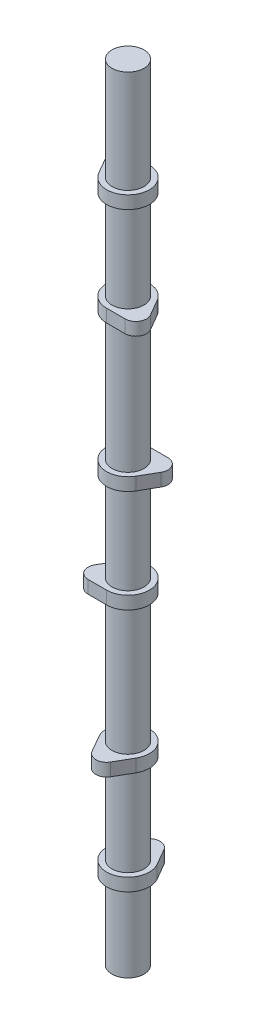
ISO-10303-21;
HEADER;
FILE_DESCRIPTION(('STEP AP214'),'2;1');
FILE_NAME('part.step','',(''),(''),'','','');
FILE_SCHEMA(('AUTOMOTIVE_DESIGN { 1 0 10303 214 1 1 1 1 }'));
ENDSEC;
DATA;
#1=APPLICATION_CONTEXT('core data for automotive mechanical design processes');
#2=APPLICATION_PROTOCOL_DEFINITION('international standard','automotive_design',2000,#1);
#3=PRODUCT_CONTEXT('',#1,'mechanical');
#4=PRODUCT('Part','Part','',(#3));
#5=PRODUCT_RELATED_PRODUCT_CATEGORY('part','',(#4));
#6=PRODUCT_DEFINITION_FORMATION('','',#4);
#7=PRODUCT_DEFINITION_CONTEXT('part definition',#1,'design');
#8=PRODUCT_DEFINITION('design','',#6,#7);
#9=PRODUCT_DEFINITION_SHAPE('','',#8);
#10=(LENGTH_UNIT() NAMED_UNIT(*) SI_UNIT(.MILLI.,.METRE.));
#11=(NAMED_UNIT(*) PLANE_ANGLE_UNIT() SI_UNIT($,.RADIAN.));
#12=(NAMED_UNIT(*) SI_UNIT($,.STERADIAN.) SOLID_ANGLE_UNIT());
#13=UNCERTAINTY_MEASURE_WITH_UNIT(LENGTH_MEASURE(1.E-05),#10,'distance_accuracy_value','');
#14=(GEOMETRIC_REPRESENTATION_CONTEXT(3) GLOBAL_UNCERTAINTY_ASSIGNED_CONTEXT((#13)) GLOBAL_UNIT_ASSIGNED_CONTEXT((#10,
#11,#12)) REPRESENTATION_CONTEXT('',''));
#15=CARTESIAN_POINT('',(0.,0.,0.));
#16=DIRECTION('',(0.,0.,1.));
#17=DIRECTION('',(1.,0.,0.));
#18=AXIS2_PLACEMENT_3D('',#15,#16,#17);
#19=CARTESIAN_POINT('',(0.,419.56,0.));
#20=DIRECTION('',(0.,-1.,0.));
#21=DIRECTION('',(0.,0.,-1.));
#22=AXIS2_PLACEMENT_3D('',#19,#20,#21);
#23=CYLINDRICAL_SURFACE('',#22,9.5);
#24=CARTESIAN_POINT('',(0.,297.72,0.));
#25=DIRECTION('',(0.,1.,0.));
#26=DIRECTION('',(0.,0.,1.));
#27=AXIS2_PLACEMENT_3D('',#24,#25,#26);
#28=CIRCLE('',#27,9.5);
#29=CARTESIAN_POINT('',(0.,297.72,9.5));
#30=VERTEX_POINT('',#29);
#31=EDGE_CURVE('E268',#30,#30,#28,.T.);
#32=ORIENTED_EDGE('',*,*,#31,.T.);
#33=EDGE_LOOP('',(#32));
#34=FACE_BOUND('',#33,.T.);
#35=CARTESIAN_POINT('',(0.,351.06,0.));
#36=DIRECTION('',(0.,1.,0.));
#37=DIRECTION('',(0.,0.,1.));
#38=AXIS2_PLACEMENT_3D('',#35,#36,#37);
#39=CIRCLE('',#38,9.5);
#40=CARTESIAN_POINT('',(0.,351.06,9.5));
#41=VERTEX_POINT('',#40);
#42=EDGE_CURVE('E11',#41,#41,#39,.T.);
#43=ORIENTED_EDGE('',*,*,#42,.F.);
#44=EDGE_LOOP('',(#43));
#45=FACE_BOUND('',#44,.T.);
#46=ADVANCED_FACE('F34',(#34,#45),#23,.T.);
#47=CARTESIAN_POINT('',(0.,213.63,0.));
#48=DIRECTION('',(0.,1.,0.));
#49=DIRECTION('',(0.,0.,1.));
#50=AXIS2_PLACEMENT_3D('',#47,#48,#49);
#51=CIRCLE('',#50,9.5);
#52=CARTESIAN_POINT('',(0.,213.63,9.5));
#53=VERTEX_POINT('',#52);
#54=EDGE_CURVE('E299',#53,#53,#51,.T.);
#55=ORIENTED_EDGE('',*,*,#54,.T.);
#56=EDGE_LOOP('',(#55));
#57=FACE_BOUND('',#56,.T.);
#58=CARTESIAN_POINT('',(0.,290.1,0.));
#59=DIRECTION('',(0.,1.,0.));
#60=DIRECTION('',(0.,0.,1.));
#61=AXIS2_PLACEMENT_3D('',#58,#59,#60);
#62=CIRCLE('',#61,9.5);
#63=CARTESIAN_POINT('',(0.,290.1,9.5));
#64=VERTEX_POINT('',#63);
#65=EDGE_CURVE('E44',#64,#64,#62,.T.);
#66=ORIENTED_EDGE('',*,*,#65,.F.);
#67=EDGE_LOOP('',(#66));
#68=FACE_BOUND('',#67,.T.);
#69=ADVANCED_FACE('F450',(#57,#68),#23,.T.);
#70=CARTESIAN_POINT('',(0.,152.67,0.));
#71=DIRECTION('',(0.,1.,0.));
#72=DIRECTION('',(0.,0.,1.));
#73=AXIS2_PLACEMENT_3D('',#70,#71,#72);
#74=CIRCLE('',#73,9.5);
#75=CARTESIAN_POINT('',(0.,152.67,9.5));
#76=VERTEX_POINT('',#75);
#77=EDGE_CURVE('E330',#76,#76,#74,.T.);
#78=ORIENTED_EDGE('',*,*,#77,.T.);
#79=EDGE_LOOP('',(#78));
#80=FACE_BOUND('',#79,.T.);
#81=CARTESIAN_POINT('',(0.,206.01,0.));
#82=DIRECTION('',(0.,1.,0.));
#83=DIRECTION('',(0.,0.,1.));
#84=AXIS2_PLACEMENT_3D('',#81,#82,#83);
#85=CIRCLE('',#84,9.5);
#86=CARTESIAN_POINT('',(0.,206.01,9.5));
#87=VERTEX_POINT('',#86);
#88=EDGE_CURVE('E403',#87,#87,#85,.T.);
#89=ORIENTED_EDGE('',*,*,#88,.F.);
#90=EDGE_LOOP('',(#89));
#91=FACE_BOUND('',#90,.T.);
#92=ADVANCED_FACE('F456',(#80,#91),#23,.T.);
#93=CARTESIAN_POINT('',(0.,68.58,0.));
#94=DIRECTION('',(0.,1.,0.));
#95=DIRECTION('',(0.,0.,1.));
#96=AXIS2_PLACEMENT_3D('',#93,#94,#95);
#97=CIRCLE('',#96,9.5);
#98=CARTESIAN_POINT('',(0.,68.58,9.5));
#99=VERTEX_POINT('',#98);
#100=EDGE_CURVE('E361',#99,#99,#97,.T.);
#101=ORIENTED_EDGE('',*,*,#100,.T.);
#102=EDGE_LOOP('',(#101));
#103=FACE_BOUND('',#102,.T.);
#104=CARTESIAN_POINT('',(0.,145.05,0.));
#105=DIRECTION('',(0.,1.,0.));
#106=DIRECTION('',(0.,0.,1.));
#107=AXIS2_PLACEMENT_3D('',#104,#105,#106);
#108=CIRCLE('',#107,9.5);
#109=CARTESIAN_POINT('',(0.,145.05,9.5));
#110=VERTEX_POINT('',#109);
#111=EDGE_CURVE('E398',#110,#110,#108,.T.);
#112=ORIENTED_EDGE('',*,*,#111,.F.);
#113=EDGE_LOOP('',(#112));
#114=FACE_BOUND('',#113,.T.);
#115=ADVANCED_FACE('F487',(#103,#114),#23,.T.);
#116=CARTESIAN_POINT('',(0.,7.62000000000002,0.));
#117=DIRECTION('',(0.,1.,0.));
#118=DIRECTION('',(0.,0.,1.));
#119=AXIS2_PLACEMENT_3D('',#116,#117,#118);
#120=CIRCLE('',#119,9.5);
#121=CARTESIAN_POINT('',(0.,7.62000000000002,9.5));
#122=VERTEX_POINT('',#121);
#123=EDGE_CURVE('E365',#122,#122,#120,.F.);
#124=ORIENTED_EDGE('',*,*,#123,.F.);
#125=EDGE_LOOP('',(#124));
#126=FACE_BOUND('',#125,.T.);
#127=CARTESIAN_POINT('',(0.,60.96,0.));
#128=DIRECTION('',(0.,1.,0.));
#129=DIRECTION('',(0.,0.,1.));
#130=AXIS2_PLACEMENT_3D('',#127,#128,#129);
#131=CIRCLE('',#130,9.5);
#132=CARTESIAN_POINT('',(0.,60.96,9.5));
#133=VERTEX_POINT('',#132);
#134=EDGE_CURVE('E395',#133,#133,#131,.T.);
#135=ORIENTED_EDGE('',*,*,#134,.F.);
#136=EDGE_LOOP('',(#135));
#137=FACE_BOUND('',#136,.T.);
#138=ADVANCED_FACE('F475',(#126,#137),#23,.T.);
#139=CARTESIAN_POINT('',(0.,7.62,-12.7));
#140=DIRECTION('',(0.,-1.,0.));
#141=DIRECTION('',(0.,0.,-1.));
#142=AXIS2_PLACEMENT_3D('',#139,#140,#141);
#143=CYLINDRICAL_SURFACE('',#142,6.35);
#144=CARTESIAN_POINT('',(0.,0.,-12.7));
#145=DIRECTION('',(0.,1.,0.));
#146=DIRECTION('',(0.,0.,1.));
#147=AXIS2_PLACEMENT_3D('',#144,#145,#146);
#148=CIRCLE('',#147,6.35);
#149=CARTESIAN_POINT('',(5.49926131403118,0.,-15.875));
#150=VERTEX_POINT('',#149);
#151=CARTESIAN_POINT('',(-5.49926131403118,0.,-15.875));
#152=VERTEX_POINT('',#151);
#153=EDGE_CURVE('E371',#150,#152,#148,.T.);
#154=ORIENTED_EDGE('',*,*,#153,.T.);
#155=DIRECTION('',(0.,-1.,0.));
#156=VECTOR('',#155,1.);
#157=CARTESIAN_POINT('',(-5.49926131403118,7.62,-15.875));
#158=LINE('',#157,#156);
#159=CARTESIAN_POINT('',(-5.49926131403118,7.62,-15.875));
#160=VERTEX_POINT('',#159);
#161=EDGE_CURVE('E390',#160,#152,#158,.T.);
#162=ORIENTED_EDGE('',*,*,#161,.F.);
#163=CARTESIAN_POINT('',(0.,7.62,-12.7));
#164=DIRECTION('',(0.,1.,0.));
#165=DIRECTION('',(0.,0.,1.));
#166=AXIS2_PLACEMENT_3D('',#163,#164,#165);
#167=CIRCLE('',#166,6.35);
#168=CARTESIAN_POINT('',(5.49926131403118,7.62,-15.875));
#169=VERTEX_POINT('',#168);
#170=EDGE_CURVE('E372',#169,#160,#167,.T.);
#171=ORIENTED_EDGE('',*,*,#170,.F.);
#172=DIRECTION('',(0.,-1.,0.));
#173=VECTOR('',#172,1.);
#174=CARTESIAN_POINT('',(5.49926131403118,7.62,-15.875));
#175=LINE('',#174,#173);
#176=EDGE_CURVE('E378',#169,#150,#175,.T.);
#177=ORIENTED_EDGE('',*,*,#176,.T.);
#178=EDGE_LOOP('',(#154,#162,#171,#177));
#179=FACE_BOUND('',#178,.T.);
#180=ADVANCED_FACE('F36',(#179),#143,.T.);
#181=CARTESIAN_POINT('',(-5.49926131403118,7.62,-15.875));
#182=DIRECTION('',(0.866025403784438,0.,0.5));
#183=DIRECTION('',(0.5,0.,-0.866025403784439));
#184=AXIS2_PLACEMENT_3D('',#181,#182,#183);
#185=PLANE('',#184);
#186=DIRECTION('',(-0.5,0.,0.866025403784439));
#187=VECTOR('',#186,1.);
#188=CARTESIAN_POINT('',(-5.49926131403118,0.,-15.875));
#189=LINE('',#188,#187);
#190=CARTESIAN_POINT('',(-10.9985226280624,0.,-6.34999999999999));
#191=VERTEX_POINT('',#190);
#192=EDGE_CURVE('E381',#152,#191,#189,.T.);
#193=ORIENTED_EDGE('',*,*,#192,.T.);
#194=DIRECTION('',(0.,-1.,0.));
#195=VECTOR('',#194,1.);
#196=CARTESIAN_POINT('',(-10.9985226280624,7.62,-6.34999999999999));
#197=LINE('',#196,#195);
#198=CARTESIAN_POINT('',(-10.9985226280624,7.62,-6.34999999999999));
#199=VERTEX_POINT('',#198);
#200=EDGE_CURVE('E388',#199,#191,#197,.T.);
#201=ORIENTED_EDGE('',*,*,#200,.F.);
#202=DIRECTION('',(-0.5,0.,0.866025403784439));
#203=VECTOR('',#202,1.);
#204=CARTESIAN_POINT('',(-5.49926131403118,7.62,-15.875));
#205=LINE('',#204,#203);
#206=EDGE_CURVE('E84',#160,#199,#205,.T.);
#207=ORIENTED_EDGE('',*,*,#206,.F.);
#208=ORIENTED_EDGE('',*,*,#161,.T.);
#209=EDGE_LOOP('',(#193,#201,#207,#208));
#210=FACE_BOUND('',#209,.T.);
#211=ADVANCED_FACE('F493',(#210),#185,.F.);
#212=CARTESIAN_POINT('',(0.,7.62,0.));
#213=DIRECTION('',(0.,-1.,0.));
#214=DIRECTION('',(0.,0.,-1.));
#215=AXIS2_PLACEMENT_3D('',#212,#213,#214);
#216=CYLINDRICAL_SURFACE('',#215,12.7);
#217=CARTESIAN_POINT('',(0.,0.,0.));
#218=DIRECTION('',(0.,1.,0.));
#219=DIRECTION('',(0.,0.,1.));
#220=AXIS2_PLACEMENT_3D('',#217,#218,#219);
#221=CIRCLE('',#220,12.7);
#222=CARTESIAN_POINT('',(10.9985226280624,0.,-6.35));
#223=VERTEX_POINT('',#222);
#224=EDGE_CURVE('E70',#191,#223,#221,.T.);
#225=ORIENTED_EDGE('',*,*,#224,.T.);
#226=DIRECTION('',(0.,-1.,0.));
#227=VECTOR('',#226,1.);
#228=CARTESIAN_POINT('',(10.9985226280624,7.62,-6.35));
#229=LINE('',#228,#227);
#230=CARTESIAN_POINT('',(10.9985226280624,7.62,-6.35));
#231=VERTEX_POINT('',#230);
#232=EDGE_CURVE('E386',#231,#223,#229,.T.);
#233=ORIENTED_EDGE('',*,*,#232,.F.);
#234=CARTESIAN_POINT('',(0.,7.62,0.));
#235=DIRECTION('',(0.,1.,0.));
#236=DIRECTION('',(0.,0.,1.));
#237=AXIS2_PLACEMENT_3D('',#234,#235,#236);
#238=CIRCLE('',#237,12.7);
#239=EDGE_CURVE('E375',#199,#231,#238,.T.);
#240=ORIENTED_EDGE('',*,*,#239,.F.);
#241=ORIENTED_EDGE('',*,*,#200,.T.);
#242=EDGE_LOOP('',(#225,#233,#240,#241));
#243=FACE_BOUND('',#242,.T.);
#244=ADVANCED_FACE('F825',(#243),#216,.T.);
#245=CARTESIAN_POINT('',(5.49926131403118,7.62,-15.875));
#246=DIRECTION('',(-0.866025403784439,0.,0.5));
#247=DIRECTION('',(0.5,0.,0.866025403784439));
#248=AXIS2_PLACEMENT_3D('',#245,#246,#247);
#249=PLANE('',#248);
#250=DIRECTION('',(-0.5,0.,-0.866025403784439));
#251=VECTOR('',#250,1.);
#252=CARTESIAN_POINT('',(5.49926131403118,0.,-15.875));
#253=LINE('',#252,#251);
#254=EDGE_CURVE('E76',#223,#150,#253,.T.);
#255=ORIENTED_EDGE('',*,*,#254,.T.);
#256=ORIENTED_EDGE('',*,*,#176,.F.);
#257=DIRECTION('',(-0.5,0.,-0.866025403784439));
#258=VECTOR('',#257,1.);
#259=CARTESIAN_POINT('',(5.49926131403118,7.62,-15.875));
#260=LINE('',#259,#258);
#261=EDGE_CURVE('E52',#231,#169,#260,.T.);
#262=ORIENTED_EDGE('',*,*,#261,.F.);
#263=ORIENTED_EDGE('',*,*,#232,.T.);
#264=EDGE_LOOP('',(#255,#256,#262,#263));
#265=FACE_BOUND('',#264,.T.);
#266=ADVANCED_FACE('F819',(#265),#249,.F.);
#267=CARTESIAN_POINT('',(0.,7.62,-12.7));
#268=DIRECTION('',(0.,1.,0.));
#269=DIRECTION('',(0.,0.,1.));
#270=AXIS2_PLACEMENT_3D('',#267,#268,#269);
#271=PLANE('',#270);
#272=ORIENTED_EDGE('',*,*,#123,.T.);
#273=EDGE_LOOP('',(#272));
#274=FACE_BOUND('',#273,.T.);
#275=ORIENTED_EDGE('',*,*,#170,.T.);
#276=ORIENTED_EDGE('',*,*,#206,.T.);
#277=ORIENTED_EDGE('',*,*,#239,.T.);
#278=ORIENTED_EDGE('',*,*,#261,.T.);
#279=EDGE_LOOP('',(#275,#276,#277,#278));
#280=FACE_BOUND('',#279,.T.);
#281=ADVANCED_FACE('F824',(#274,#280),#271,.T.);
#282=CARTESIAN_POINT('',(0.,0.,-12.7));
#283=DIRECTION('',(0.,1.,0.));
#284=DIRECTION('',(0.,0.,1.));
#285=AXIS2_PLACEMENT_3D('',#282,#283,#284);
#286=PLANE('',#285);
#287=CARTESIAN_POINT('',(0.,0.,0.));
#288=DIRECTION('',(0.,1.,0.));
#289=DIRECTION('',(0.,0.,1.));
#290=AXIS2_PLACEMENT_3D('',#287,#288,#289);
#291=CIRCLE('',#290,9.5);
#292=CARTESIAN_POINT('',(0.,0.,9.5));
#293=VERTEX_POINT('',#292);
#294=EDGE_CURVE('E392',#293,#293,#291,.F.);
#295=ORIENTED_EDGE('',*,*,#294,.F.);
#296=EDGE_LOOP('',(#295));
#297=FACE_BOUND('',#296,.T.);
#298=ORIENTED_EDGE('',*,*,#153,.F.);
#299=ORIENTED_EDGE('',*,*,#254,.F.);
#300=ORIENTED_EDGE('',*,*,#224,.F.);
#301=ORIENTED_EDGE('',*,*,#192,.F.);
#302=EDGE_LOOP('',(#298,#299,#300,#301));
#303=FACE_BOUND('',#302,.T.);
#304=ADVANCED_FACE('F483',(#297,#303),#286,.F.);
#305=CARTESIAN_POINT('',(0.,-46.53,0.));
#306=DIRECTION('',(0.,1.,0.));
#307=DIRECTION('',(0.,0.,1.));
#308=AXIS2_PLACEMENT_3D('',#305,#306,#307);
#309=PLANE('',#308);
#310=CARTESIAN_POINT('',(0.,-46.53,0.));
#311=DIRECTION('',(0.,1.,0.));
#312=DIRECTION('',(0.,0.,1.));
#313=AXIS2_PLACEMENT_3D('',#310,#311,#312);
#314=CIRCLE('',#313,9.5);
#315=CARTESIAN_POINT('',(0.,-46.53,9.5));
#316=VERTEX_POINT('',#315);
#317=EDGE_CURVE('E366',#316,#316,#314,.T.);
#318=ORIENTED_EDGE('',*,*,#317,.F.);
#319=EDGE_LOOP('',(#318));
#320=FACE_BOUND('',#319,.T.);
#321=ADVANCED_FACE('F473',(#320),#309,.F.);
#322=ORIENTED_EDGE('',*,*,#317,.T.);
#323=EDGE_LOOP('',(#322));
#324=FACE_BOUND('',#323,.T.);
#325=ORIENTED_EDGE('',*,*,#294,.T.);
#326=EDGE_LOOP('',(#325));
#327=FACE_BOUND('',#326,.T.);
#328=ADVANCED_FACE('F463',(#324,#327),#23,.T.);
#329=CARTESIAN_POINT('',(0.,68.58,12.7));
#330=DIRECTION('',(0.,-1.,0.));
#331=DIRECTION('',(0.,0.,1.));
#332=AXIS2_PLACEMENT_3D('',#329,#330,#331);
#333=CYLINDRICAL_SURFACE('',#332,6.35);
#334=CARTESIAN_POINT('',(0.,60.96,12.7));
#335=DIRECTION('',(0.,1.,0.));
#336=DIRECTION('',(0.,0.,-1.));
#337=AXIS2_PLACEMENT_3D('',#334,#335,#336);
#338=CIRCLE('',#337,6.35);
#339=CARTESIAN_POINT('',(-5.4992613140313,60.96,15.875));
#340=VERTEX_POINT('',#339);
#341=CARTESIAN_POINT('',(5.49926131403107,60.96,15.875));
#342=VERTEX_POINT('',#341);
#343=EDGE_CURVE('E342',#340,#342,#338,.T.);
#344=ORIENTED_EDGE('',*,*,#343,.T.);
#345=DIRECTION('',(0.,-1.,0.));
#346=VECTOR('',#345,1.);
#347=CARTESIAN_POINT('',(5.49926131403107,68.58,15.875));
#348=LINE('',#347,#346);
#349=CARTESIAN_POINT('',(5.49926131403107,68.58,15.875));
#350=VERTEX_POINT('',#349);
#351=EDGE_CURVE('E358',#350,#342,#348,.T.);
#352=ORIENTED_EDGE('',*,*,#351,.F.);
#353=CARTESIAN_POINT('',(0.,68.58,12.7));
#354=DIRECTION('',(0.,1.,0.));
#355=DIRECTION('',(0.,0.,-1.));
#356=AXIS2_PLACEMENT_3D('',#353,#354,#355);
#357=CIRCLE('',#356,6.35);
#358=CARTESIAN_POINT('',(-5.4992613140313,68.58,15.875));
#359=VERTEX_POINT('',#358);
#360=EDGE_CURVE('E331',#359,#350,#357,.T.);
#361=ORIENTED_EDGE('',*,*,#360,.F.);
#362=DIRECTION('',(0.,-1.,0.));
#363=VECTOR('',#362,1.);
#364=CARTESIAN_POINT('',(-5.4992613140313,68.58,15.875));
#365=LINE('',#364,#363);
#366=EDGE_CURVE('E341',#359,#340,#365,.T.);
#367=ORIENTED_EDGE('',*,*,#366,.T.);
#368=EDGE_LOOP('',(#344,#352,#361,#367));
#369=FACE_BOUND('',#368,.T.);
#370=ADVANCED_FACE('F472',(#369),#333,.T.);
#371=CARTESIAN_POINT('',(5.49926131403107,68.58,15.875));
#372=DIRECTION('',(-0.866025403784435,0.,-0.500000000000006));
#373=DIRECTION('',(-0.500000000000006,0.,0.866025403784435));
#374=AXIS2_PLACEMENT_3D('',#371,#372,#373);
#375=PLANE('',#374);
#376=DIRECTION('',(0.500000000000006,0.,-0.866025403784435));
#377=VECTOR('',#376,1.);
#378=CARTESIAN_POINT('',(5.49926131403107,60.96,15.875));
#379=LINE('',#378,#377);
#380=CARTESIAN_POINT('',(10.9985226280623,60.96,6.35000000000007));
#381=VERTEX_POINT('',#380);
#382=EDGE_CURVE('E345',#342,#381,#379,.T.);
#383=ORIENTED_EDGE('',*,*,#382,.T.);
#384=DIRECTION('',(0.,-1.,0.));
#385=VECTOR('',#384,1.);
#386=CARTESIAN_POINT('',(10.9985226280623,68.58,6.35000000000007));
#387=LINE('',#386,#385);
#388=CARTESIAN_POINT('',(10.9985226280623,68.58,6.35000000000007));
#389=VERTEX_POINT('',#388);
#390=EDGE_CURVE('E355',#389,#381,#387,.T.);
#391=ORIENTED_EDGE('',*,*,#390,.F.);
#392=DIRECTION('',(0.500000000000006,0.,-0.866025403784435));
#393=VECTOR('',#392,1.);
#394=CARTESIAN_POINT('',(5.49926131403107,68.58,15.875));
#395=LINE('',#394,#393);
#396=EDGE_CURVE('E334',#350,#389,#395,.T.);
#397=ORIENTED_EDGE('',*,*,#396,.F.);
#398=ORIENTED_EDGE('',*,*,#351,.T.);
#399=EDGE_LOOP('',(#383,#391,#397,#398));
#400=FACE_BOUND('',#399,.T.);
#401=ADVANCED_FACE('F480',(#400),#375,.F.);
#402=CARTESIAN_POINT('',(0.,68.58,0.));
#403=DIRECTION('',(0.,-1.,0.));
#404=DIRECTION('',(0.,0.,1.));
#405=AXIS2_PLACEMENT_3D('',#402,#403,#404);
#406=CYLINDRICAL_SURFACE('',#405,12.7);
#407=CARTESIAN_POINT('',(0.,60.96,0.));
#408=DIRECTION('',(0.,1.,0.));
#409=DIRECTION('',(0.,0.,-1.));
#410=AXIS2_PLACEMENT_3D('',#407,#408,#409);
#411=CIRCLE('',#410,12.7);
#412=CARTESIAN_POINT('',(-10.9985226280624,60.96,6.34999999999992));
#413=VERTEX_POINT('',#412);
#414=EDGE_CURVE('E347',#381,#413,#411,.T.);
#415=ORIENTED_EDGE('',*,*,#414,.T.);
#416=DIRECTION('',(0.,-1.,0.));
#417=VECTOR('',#416,1.);
#418=CARTESIAN_POINT('',(-10.9985226280624,68.58,6.34999999999992));
#419=LINE('',#418,#417);
#420=CARTESIAN_POINT('',(-10.9985226280624,68.58,6.34999999999992));
#421=VERTEX_POINT('',#420);
#422=EDGE_CURVE('E352',#421,#413,#419,.T.);
#423=ORIENTED_EDGE('',*,*,#422,.F.);
#424=CARTESIAN_POINT('',(0.,68.58,0.));
#425=DIRECTION('',(0.,1.,0.));
#426=DIRECTION('',(0.,0.,-1.));
#427=AXIS2_PLACEMENT_3D('',#424,#425,#426);
#428=CIRCLE('',#427,12.7);
#429=EDGE_CURVE('E337',#389,#421,#428,.T.);
#430=ORIENTED_EDGE('',*,*,#429,.F.);
#431=ORIENTED_EDGE('',*,*,#390,.T.);
#432=EDGE_LOOP('',(#415,#423,#430,#431));
#433=FACE_BOUND('',#432,.T.);
#434=ADVANCED_FACE('F518',(#433),#406,.T.);
#435=CARTESIAN_POINT('',(-5.4992613140313,68.58,15.875));
#436=DIRECTION('',(0.866025403784442,0.,-0.499999999999994));
#437=DIRECTION('',(-0.499999999999994,0.,-0.866025403784442));
#438=AXIS2_PLACEMENT_3D('',#435,#436,#437);
#439=PLANE('',#438);
#440=DIRECTION('',(0.499999999999994,0.,0.866025403784442));
#441=VECTOR('',#440,1.);
#442=CARTESIAN_POINT('',(-5.4992613140313,60.96,15.875));
#443=LINE('',#442,#441);
#444=EDGE_CURVE('E335',#413,#340,#443,.T.);
#445=ORIENTED_EDGE('',*,*,#444,.T.);
#446=ORIENTED_EDGE('',*,*,#366,.F.);
#447=DIRECTION('',(0.499999999999994,0.,0.866025403784442));
#448=VECTOR('',#447,1.);
#449=CARTESIAN_POINT('',(-5.4992613140313,68.58,15.875));
#450=LINE('',#449,#448);
#451=EDGE_CURVE('E339',#421,#359,#450,.T.);
#452=ORIENTED_EDGE('',*,*,#451,.F.);
#453=ORIENTED_EDGE('',*,*,#422,.T.);
#454=EDGE_LOOP('',(#445,#446,#452,#453));
#455=FACE_BOUND('',#454,.T.);
#456=ADVANCED_FACE('F514',(#455),#439,.F.);
#457=CARTESIAN_POINT('',(0.,68.58,12.7));
#458=DIRECTION('',(0.,1.,0.));
#459=DIRECTION('',(0.,0.,-1.));
#460=AXIS2_PLACEMENT_3D('',#457,#458,#459);
#461=PLANE('',#460);
#462=ORIENTED_EDGE('',*,*,#100,.F.);
#463=EDGE_LOOP('',(#462));
#464=FACE_BOUND('',#463,.T.);
#465=ORIENTED_EDGE('',*,*,#360,.T.);
#466=ORIENTED_EDGE('',*,*,#396,.T.);
#467=ORIENTED_EDGE('',*,*,#429,.T.);
#468=ORIENTED_EDGE('',*,*,#451,.T.);
#469=EDGE_LOOP('',(#465,#466,#467,#468));
#470=FACE_BOUND('',#469,.T.);
#471=ADVANCED_FACE('F504',(#464,#470),#461,.T.);
#472=CARTESIAN_POINT('',(0.,60.96,12.7));
#473=DIRECTION('',(0.,1.,0.));
#474=DIRECTION('',(0.,0.,-1.));
#475=AXIS2_PLACEMENT_3D('',#472,#473,#474);
#476=PLANE('',#475);
#477=ORIENTED_EDGE('',*,*,#134,.T.);
#478=EDGE_LOOP('',(#477));
#479=FACE_BOUND('',#478,.T.);
#480=ORIENTED_EDGE('',*,*,#343,.F.);
#481=ORIENTED_EDGE('',*,*,#444,.F.);
#482=ORIENTED_EDGE('',*,*,#414,.F.);
#483=ORIENTED_EDGE('',*,*,#382,.F.);
#484=EDGE_LOOP('',(#480,#481,#482,#483));
#485=FACE_BOUND('',#484,.T.);
#486=ADVANCED_FACE('F500',(#479,#485),#476,.F.);
#487=CARTESIAN_POINT('',(-10.9985226280623,152.67,6.35000000000005));
#488=DIRECTION('',(0.,-1.,0.));
#489=DIRECTION('',(-0.866025403784436,0.,0.500000000000004));
#490=AXIS2_PLACEMENT_3D('',#487,#488,#489);
#491=CYLINDRICAL_SURFACE('',#490,6.35);
#492=CARTESIAN_POINT('',(-10.9985226280623,145.05,6.35000000000005));
#493=DIRECTION('',(0.,1.,0.));
#494=DIRECTION('',(0.866025403784436,0.,-0.500000000000004));
#495=AXIS2_PLACEMENT_3D('',#492,#493,#494);
#496=CIRCLE('',#495,6.35);
#497=CARTESIAN_POINT('',(-16.4977839420935,145.05,3.17500000000008));
#498=VERTEX_POINT('',#497);
#499=CARTESIAN_POINT('',(-10.9985226280623,145.05,12.7000000000001));
#500=VERTEX_POINT('',#499);
#501=EDGE_CURVE('E311',#498,#500,#496,.T.);
#502=ORIENTED_EDGE('',*,*,#501,.T.);
#503=DIRECTION('',(0.,-1.,0.));
#504=VECTOR('',#503,1.);
#505=CARTESIAN_POINT('',(-10.9985226280623,152.67,12.7000000000001));
#506=LINE('',#505,#504);
#507=CARTESIAN_POINT('',(-10.9985226280623,152.67,12.7000000000001));
#508=VERTEX_POINT('',#507);
#509=EDGE_CURVE('E327',#508,#500,#506,.T.);
#510=ORIENTED_EDGE('',*,*,#509,.F.);
#511=CARTESIAN_POINT('',(-10.9985226280623,152.67,6.35000000000005));
#512=DIRECTION('',(0.,1.,0.));
#513=DIRECTION('',(0.866025403784436,0.,-0.500000000000004));
#514=AXIS2_PLACEMENT_3D('',#511,#512,#513);
#515=CIRCLE('',#514,6.35);
#516=CARTESIAN_POINT('',(-16.4977839420935,152.67,3.17500000000008));
#517=VERTEX_POINT('',#516);
#518=EDGE_CURVE('E300',#517,#508,#515,.T.);
#519=ORIENTED_EDGE('',*,*,#518,.F.);
#520=DIRECTION('',(0.,-1.,0.));
#521=VECTOR('',#520,1.);
#522=CARTESIAN_POINT('',(-16.4977839420935,152.67,3.17500000000008));
#523=LINE('',#522,#521);
#524=EDGE_CURVE('E310',#517,#498,#523,.T.);
#525=ORIENTED_EDGE('',*,*,#524,.T.);
#526=EDGE_LOOP('',(#502,#510,#519,#525));
#527=FACE_BOUND('',#526,.T.);
#528=ADVANCED_FACE('F503',(#527),#491,.T.);
#529=CARTESIAN_POINT('',(-10.9985226280623,152.67,12.7000000000001));
#530=DIRECTION('',(0.,0.,-1.));
#531=DIRECTION('',(-1.,0.,0.));
#532=AXIS2_PLACEMENT_3D('',#529,#530,#531);
#533=PLANE('',#532);
#534=DIRECTION('',(1.,0.,0.));
#535=VECTOR('',#534,1.);
#536=CARTESIAN_POINT('',(-10.9985226280623,145.05,12.7000000000001));
#537=LINE('',#536,#535);
#538=CARTESIAN_POINT('',(0.,145.05,12.7));
#539=VERTEX_POINT('',#538);
#540=EDGE_CURVE('E314',#500,#539,#537,.T.);
#541=ORIENTED_EDGE('',*,*,#540,.T.);
#542=DIRECTION('',(0.,-1.,0.));
#543=VECTOR('',#542,1.);
#544=CARTESIAN_POINT('',(0.,152.67,12.7));
#545=LINE('',#544,#543);
#546=CARTESIAN_POINT('',(0.,152.67,12.7));
#547=VERTEX_POINT('',#546);
#548=EDGE_CURVE('E324',#547,#539,#545,.T.);
#549=ORIENTED_EDGE('',*,*,#548,.F.);
#550=DIRECTION('',(1.,0.,0.));
#551=VECTOR('',#550,1.);
#552=CARTESIAN_POINT('',(-10.9985226280623,152.67,12.7000000000001));
#553=LINE('',#552,#551);
#554=EDGE_CURVE('E303',#508,#547,#553,.T.);
#555=ORIENTED_EDGE('',*,*,#554,.F.);
#556=ORIENTED_EDGE('',*,*,#509,.T.);
#557=EDGE_LOOP('',(#541,#549,#555,#556));
#558=FACE_BOUND('',#557,.T.);
#559=ADVANCED_FACE('F567',(#558),#533,.F.);
#560=CARTESIAN_POINT('',(0.,152.67,0.));
#561=DIRECTION('',(0.,-1.,0.));
#562=DIRECTION('',(-0.866025403784436,0.,0.500000000000004));
#563=AXIS2_PLACEMENT_3D('',#560,#561,#562);
#564=CYLINDRICAL_SURFACE('',#563,12.7);
#565=CARTESIAN_POINT('',(0.,145.05,0.));
#566=DIRECTION('',(0.,1.,0.));
#567=DIRECTION('',(0.866025403784436,0.,-0.500000000000004));
#568=AXIS2_PLACEMENT_3D('',#565,#566,#567);
#569=CIRCLE('',#568,12.7);
#570=CARTESIAN_POINT('',(-10.9985226280624,145.05,-6.34999999999995));
#571=VERTEX_POINT('',#570);
#572=EDGE_CURVE('E316',#539,#571,#569,.T.);
#573=ORIENTED_EDGE('',*,*,#572,.T.);
#574=DIRECTION('',(0.,-1.,0.));
#575=VECTOR('',#574,1.);
#576=CARTESIAN_POINT('',(-10.9985226280624,152.67,-6.34999999999995));
#577=LINE('',#576,#575);
#578=CARTESIAN_POINT('',(-10.9985226280624,152.67,-6.34999999999995));
#579=VERTEX_POINT('',#578);
#580=EDGE_CURVE('E321',#579,#571,#577,.T.);
#581=ORIENTED_EDGE('',*,*,#580,.F.);
#582=CARTESIAN_POINT('',(0.,152.67,0.));
#583=DIRECTION('',(0.,1.,0.));
#584=DIRECTION('',(0.866025403784436,0.,-0.500000000000004));
#585=AXIS2_PLACEMENT_3D('',#582,#583,#584);
#586=CIRCLE('',#585,12.7);
#587=EDGE_CURVE('E306',#547,#579,#586,.T.);
#588=ORIENTED_EDGE('',*,*,#587,.F.);
#589=ORIENTED_EDGE('',*,*,#548,.T.);
#590=EDGE_LOOP('',(#573,#581,#588,#589));
#591=FACE_BOUND('',#590,.T.);
#592=ADVANCED_FACE('F576',(#591),#564,.T.);
#593=CARTESIAN_POINT('',(-16.4977839420935,152.67,3.17500000000008));
#594=DIRECTION('',(0.866025403784441,0.,0.499999999999996));
#595=DIRECTION('',(0.499999999999996,0.,-0.866025403784441));
#596=AXIS2_PLACEMENT_3D('',#593,#594,#595);
#597=PLANE('',#596);
#598=DIRECTION('',(-0.499999999999996,0.,0.866025403784441));
#599=VECTOR('',#598,1.);
#600=CARTESIAN_POINT('',(-16.4977839420935,145.05,3.17500000000008));
#601=LINE('',#600,#599);
#602=EDGE_CURVE('E304',#571,#498,#601,.T.);
#603=ORIENTED_EDGE('',*,*,#602,.T.);
#604=ORIENTED_EDGE('',*,*,#524,.F.);
#605=DIRECTION('',(-0.499999999999996,0.,0.866025403784441));
#606=VECTOR('',#605,1.);
#607=CARTESIAN_POINT('',(-16.4977839420935,152.67,3.17500000000008));
#608=LINE('',#607,#606);
#609=EDGE_CURVE('E308',#579,#517,#608,.T.);
#610=ORIENTED_EDGE('',*,*,#609,.F.);
#611=ORIENTED_EDGE('',*,*,#580,.T.);
#612=EDGE_LOOP('',(#603,#604,#610,#611));
#613=FACE_BOUND('',#612,.T.);
#614=ADVANCED_FACE('F585',(#613),#597,.F.);
#615=CARTESIAN_POINT('',(-10.9985226280623,152.67,6.35000000000005));
#616=DIRECTION('',(0.,1.,0.));
#617=DIRECTION('',(0.866025403784436,0.,-0.500000000000004));
#618=AXIS2_PLACEMENT_3D('',#615,#616,#617);
#619=PLANE('',#618);
#620=ORIENTED_EDGE('',*,*,#77,.F.);
#621=EDGE_LOOP('',(#620));
#622=FACE_BOUND('',#621,.T.);
#623=ORIENTED_EDGE('',*,*,#518,.T.);
#624=ORIENTED_EDGE('',*,*,#554,.T.);
#625=ORIENTED_EDGE('',*,*,#587,.T.);
#626=ORIENTED_EDGE('',*,*,#609,.T.);
#627=EDGE_LOOP('',(#623,#624,#625,#626));
#628=FACE_BOUND('',#627,.T.);
#629=ADVANCED_FACE('F595',(#622,#628),#619,.T.);
#630=CARTESIAN_POINT('',(-10.9985226280623,145.05,6.35000000000005));
#631=DIRECTION('',(0.,1.,0.));
#632=DIRECTION('',(0.866025403784436,0.,-0.500000000000004));
#633=AXIS2_PLACEMENT_3D('',#630,#631,#632);
#634=PLANE('',#633);
#635=ORIENTED_EDGE('',*,*,#111,.T.);
#636=EDGE_LOOP('',(#635));
#637=FACE_BOUND('',#636,.T.);
#638=ORIENTED_EDGE('',*,*,#501,.F.);
#639=ORIENTED_EDGE('',*,*,#602,.F.);
#640=ORIENTED_EDGE('',*,*,#572,.F.);
#641=ORIENTED_EDGE('',*,*,#540,.F.);
#642=EDGE_LOOP('',(#638,#639,#640,#641));
#643=FACE_BOUND('',#642,.T.);
#644=ADVANCED_FACE('F605',(#637,#643),#634,.F.);
#645=CARTESIAN_POINT('',(10.9985226280624,213.63,-6.34999999999997));
#646=DIRECTION('',(0.,-1.,0.));
#647=DIRECTION('',(0.86602540378444,0.,-0.499999999999998));
#648=AXIS2_PLACEMENT_3D('',#645,#646,#647);
#649=CYLINDRICAL_SURFACE('',#648,6.35);
#650=CARTESIAN_POINT('',(10.9985226280624,206.01,-6.34999999999997));
#651=DIRECTION('',(0.,1.,0.));
#652=DIRECTION('',(-0.86602540378444,0.,0.499999999999998));
#653=AXIS2_PLACEMENT_3D('',#650,#651,#652);
#654=CIRCLE('',#653,6.35);
#655=CARTESIAN_POINT('',(16.4977839420936,206.01,-3.17499999999996));
#656=VERTEX_POINT('',#655);
#657=CARTESIAN_POINT('',(10.9985226280624,206.01,-12.7));
#658=VERTEX_POINT('',#657);
#659=EDGE_CURVE('E280',#656,#658,#654,.T.);
#660=ORIENTED_EDGE('',*,*,#659,.T.);
#661=DIRECTION('',(0.,-1.,0.));
#662=VECTOR('',#661,1.);
#663=CARTESIAN_POINT('',(10.9985226280624,213.63,-12.7));
#664=LINE('',#663,#662);
#665=CARTESIAN_POINT('',(10.9985226280624,213.63,-12.7));
#666=VERTEX_POINT('',#665);
#667=EDGE_CURVE('E296',#666,#658,#664,.T.);
#668=ORIENTED_EDGE('',*,*,#667,.F.);
#669=CARTESIAN_POINT('',(10.9985226280624,213.63,-6.34999999999997));
#670=DIRECTION('',(0.,1.,0.));
#671=DIRECTION('',(-0.86602540378444,0.,0.499999999999998));
#672=AXIS2_PLACEMENT_3D('',#669,#670,#671);
#673=CIRCLE('',#672,6.35);
#674=CARTESIAN_POINT('',(16.4977839420936,213.63,-3.17499999999996));
#675=VERTEX_POINT('',#674);
#676=EDGE_CURVE('E269',#675,#666,#673,.T.);
#677=ORIENTED_EDGE('',*,*,#676,.F.);
#678=DIRECTION('',(0.,-1.,0.));
#679=VECTOR('',#678,1.);
#680=CARTESIAN_POINT('',(16.4977839420936,213.63,-3.17499999999996));
#681=LINE('',#680,#679);
#682=EDGE_CURVE('E279',#675,#656,#681,.T.);
#683=ORIENTED_EDGE('',*,*,#682,.T.);
#684=EDGE_LOOP('',(#660,#668,#677,#683));
#685=FACE_BOUND('',#684,.T.);
#686=ADVANCED_FACE('F615',(#685),#649,.T.);
#687=CARTESIAN_POINT('',(10.9985226280624,213.63,-12.7));
#688=DIRECTION('',(0.,0.,1.));
#689=DIRECTION('',(1.,0.,0.));
#690=AXIS2_PLACEMENT_3D('',#687,#688,#689);
#691=PLANE('',#690);
#692=DIRECTION('',(-1.,0.,0.));
#693=VECTOR('',#692,1.);
#694=CARTESIAN_POINT('',(10.9985226280624,206.01,-12.7));
#695=LINE('',#694,#693);
#696=CARTESIAN_POINT('',(0.,206.01,-12.7));
#697=VERTEX_POINT('',#696);
#698=EDGE_CURVE('E283',#658,#697,#695,.T.);
#699=ORIENTED_EDGE('',*,*,#698,.T.);
#700=DIRECTION('',(0.,-1.,0.));
#701=VECTOR('',#700,1.);
#702=CARTESIAN_POINT('',(0.,213.63,-12.7));
#703=LINE('',#702,#701);
#704=CARTESIAN_POINT('',(0.,213.63,-12.7));
#705=VERTEX_POINT('',#704);
#706=EDGE_CURVE('E293',#705,#697,#703,.T.);
#707=ORIENTED_EDGE('',*,*,#706,.F.);
#708=DIRECTION('',(-1.,0.,0.));
#709=VECTOR('',#708,1.);
#710=CARTESIAN_POINT('',(10.9985226280624,213.63,-12.7));
#711=LINE('',#710,#709);
#712=EDGE_CURVE('E272',#666,#705,#711,.T.);
#713=ORIENTED_EDGE('',*,*,#712,.F.);
#714=ORIENTED_EDGE('',*,*,#667,.T.);
#715=EDGE_LOOP('',(#699,#707,#713,#714));
#716=FACE_BOUND('',#715,.T.);
#717=ADVANCED_FACE('F625',(#716),#691,.F.);
#718=CARTESIAN_POINT('',(0.,213.63,0.));
#719=DIRECTION('',(0.,-1.,0.));
#720=DIRECTION('',(0.86602540378444,0.,-0.499999999999998));
#721=AXIS2_PLACEMENT_3D('',#718,#719,#720);
#722=CYLINDRICAL_SURFACE('',#721,12.7);
#723=CARTESIAN_POINT('',(0.,206.01,0.));
#724=DIRECTION('',(0.,1.,0.));
#725=DIRECTION('',(-0.86602540378444,0.,0.499999999999998));
#726=AXIS2_PLACEMENT_3D('',#723,#724,#725);
#727=CIRCLE('',#726,12.7);
#728=CARTESIAN_POINT('',(10.9985226280624,206.01,6.35000000000002));
#729=VERTEX_POINT('',#728);
#730=EDGE_CURVE('E285',#697,#729,#727,.T.);
#731=ORIENTED_EDGE('',*,*,#730,.T.);
#732=DIRECTION('',(0.,-1.,0.));
#733=VECTOR('',#732,1.);
#734=CARTESIAN_POINT('',(10.9985226280624,213.63,6.35000000000002));
#735=LINE('',#734,#733);
#736=CARTESIAN_POINT('',(10.9985226280624,213.63,6.35000000000002));
#737=VERTEX_POINT('',#736);
#738=EDGE_CURVE('E290',#737,#729,#735,.T.);
#739=ORIENTED_EDGE('',*,*,#738,.F.);
#740=CARTESIAN_POINT('',(0.,213.63,0.));
#741=DIRECTION('',(0.,1.,0.));
#742=DIRECTION('',(-0.86602540378444,0.,0.499999999999998));
#743=AXIS2_PLACEMENT_3D('',#740,#741,#742);
#744=CIRCLE('',#743,12.7);
#745=EDGE_CURVE('E275',#705,#737,#744,.T.);
#746=ORIENTED_EDGE('',*,*,#745,.F.);
#747=ORIENTED_EDGE('',*,*,#706,.T.);
#748=EDGE_LOOP('',(#731,#739,#746,#747));
#749=FACE_BOUND('',#748,.T.);
#750=ADVANCED_FACE('F635',(#749),#722,.T.);
#751=CARTESIAN_POINT('',(16.4977839420936,213.63,-3.17499999999996));
#752=DIRECTION('',(-0.866025403784437,0.,-0.500000000000002));
#753=DIRECTION('',(-0.500000000000002,0.,0.866025403784437));
#754=AXIS2_PLACEMENT_3D('',#751,#752,#753);
#755=PLANE('',#754);
#756=DIRECTION('',(0.500000000000002,0.,-0.866025403784437));
#757=VECTOR('',#756,1.);
#758=CARTESIAN_POINT('',(16.4977839420936,206.01,-3.17499999999996));
#759=LINE('',#758,#757);
#760=EDGE_CURVE('E273',#729,#656,#759,.T.);
#761=ORIENTED_EDGE('',*,*,#760,.T.);
#762=ORIENTED_EDGE('',*,*,#682,.F.);
#763=DIRECTION('',(0.500000000000002,0.,-0.866025403784437));
#764=VECTOR('',#763,1.);
#765=CARTESIAN_POINT('',(16.4977839420936,213.63,-3.17499999999996));
#766=LINE('',#765,#764);
#767=EDGE_CURVE('E277',#737,#675,#766,.T.);
#768=ORIENTED_EDGE('',*,*,#767,.F.);
#769=ORIENTED_EDGE('',*,*,#738,.T.);
#770=EDGE_LOOP('',(#761,#762,#768,#769));
#771=FACE_BOUND('',#770,.T.);
#772=ADVANCED_FACE('F645',(#771),#755,.F.);
#773=CARTESIAN_POINT('',(10.9985226280624,213.63,-6.34999999999997));
#774=DIRECTION('',(0.,1.,0.));
#775=DIRECTION('',(-0.86602540378444,0.,0.499999999999998));
#776=AXIS2_PLACEMENT_3D('',#773,#774,#775);
#777=PLANE('',#776);
#778=ORIENTED_EDGE('',*,*,#54,.F.);
#779=EDGE_LOOP('',(#778));
#780=FACE_BOUND('',#779,.T.);
#781=ORIENTED_EDGE('',*,*,#676,.T.);
#782=ORIENTED_EDGE('',*,*,#712,.T.);
#783=ORIENTED_EDGE('',*,*,#745,.T.);
#784=ORIENTED_EDGE('',*,*,#767,.T.);
#785=EDGE_LOOP('',(#781,#782,#783,#784));
#786=FACE_BOUND('',#785,.T.);
#787=ADVANCED_FACE('F655',(#780,#786),#777,.T.);
#788=CARTESIAN_POINT('',(10.9985226280624,206.01,-6.34999999999997));
#789=DIRECTION('',(0.,1.,0.));
#790=DIRECTION('',(-0.86602540378444,0.,0.499999999999998));
#791=AXIS2_PLACEMENT_3D('',#788,#789,#790);
#792=PLANE('',#791);
#793=ORIENTED_EDGE('',*,*,#88,.T.);
#794=EDGE_LOOP('',(#793));
#795=FACE_BOUND('',#794,.T.);
#796=ORIENTED_EDGE('',*,*,#659,.F.);
#797=ORIENTED_EDGE('',*,*,#760,.F.);
#798=ORIENTED_EDGE('',*,*,#730,.F.);
#799=ORIENTED_EDGE('',*,*,#698,.F.);
#800=EDGE_LOOP('',(#796,#797,#798,#799));
#801=FACE_BOUND('',#800,.T.);
#802=ADVANCED_FACE('F665',(#795,#801),#792,.F.);
#803=CARTESIAN_POINT('',(10.9985226280624,297.72,6.3499999999999));
#804=DIRECTION('',(0.,-1.,0.));
#805=DIRECTION('',(0.866025403784443,0.,0.499999999999992));
#806=AXIS2_PLACEMENT_3D('',#803,#804,#805);
#807=CYLINDRICAL_SURFACE('',#806,6.35);
#808=CARTESIAN_POINT('',(10.9985226280624,290.1,6.3499999999999));
#809=DIRECTION('',(0.,1.,0.));
#810=DIRECTION('',(-0.866025403784443,0.,-0.499999999999992));
#811=AXIS2_PLACEMENT_3D('',#808,#809,#810);
#812=CIRCLE('',#811,6.35);
#813=CARTESIAN_POINT('',(10.9985226280625,290.1,12.6999999999999));
#814=VERTEX_POINT('',#813);
#815=CARTESIAN_POINT('',(16.4977839420936,290.1,3.17499999999985));
#816=VERTEX_POINT('',#815);
#817=EDGE_CURVE('E234',#814,#816,#812,.T.);
#818=ORIENTED_EDGE('',*,*,#817,.T.);
#819=DIRECTION('',(0.,-1.,0.));
#820=VECTOR('',#819,1.);
#821=CARTESIAN_POINT('',(16.4977839420936,297.72,3.17499999999985));
#822=LINE('',#821,#820);
#823=CARTESIAN_POINT('',(16.4977839420936,297.72,3.17499999999985));
#824=VERTEX_POINT('',#823);
#825=EDGE_CURVE('E265',#824,#816,#822,.T.);
#826=ORIENTED_EDGE('',*,*,#825,.F.);
#827=CARTESIAN_POINT('',(10.9985226280624,297.72,6.3499999999999));
#828=DIRECTION('',(0.,1.,0.));
#829=DIRECTION('',(-0.866025403784443,0.,-0.499999999999992));
#830=AXIS2_PLACEMENT_3D('',#827,#828,#829);
#831=CIRCLE('',#830,6.35);
#832=CARTESIAN_POINT('',(10.9985226280625,297.72,12.6999999999999));
#833=VERTEX_POINT('',#832);
#834=EDGE_CURVE('E239',#833,#824,#831,.T.);
#835=ORIENTED_EDGE('',*,*,#834,.F.);
#836=DIRECTION('',(0.,-1.,0.));
#837=VECTOR('',#836,1.);
#838=CARTESIAN_POINT('',(10.9985226280625,297.72,12.6999999999999));
#839=LINE('',#838,#837);
#840=EDGE_CURVE('E249',#833,#814,#839,.T.);
#841=ORIENTED_EDGE('',*,*,#840,.T.);
#842=EDGE_LOOP('',(#818,#826,#835,#841));
#843=FACE_BOUND('',#842,.T.);
#844=ADVANCED_FACE('F429',(#843),#807,.T.);
#845=CARTESIAN_POINT('',(16.4977839420936,297.72,3.17499999999985));
#846=DIRECTION('',(-0.866025403784434,0.,0.500000000000008));
#847=DIRECTION('',(0.500000000000008,0.,0.866025403784434));
#848=AXIS2_PLACEMENT_3D('',#845,#846,#847);
#849=PLANE('',#848);
#850=DIRECTION('',(-0.500000000000008,0.,-0.866025403784434));
#851=VECTOR('',#850,1.);
#852=CARTESIAN_POINT('',(16.4977839420936,290.1,3.17499999999985));
#853=LINE('',#852,#851);
#854=CARTESIAN_POINT('',(10.9985226280623,290.1,-6.3500000000001));
#855=VERTEX_POINT('',#854);
#856=EDGE_CURVE('E252',#816,#855,#853,.T.);
#857=ORIENTED_EDGE('',*,*,#856,.T.);
#858=DIRECTION('',(0.,-1.,0.));
#859=VECTOR('',#858,1.);
#860=CARTESIAN_POINT('',(10.9985226280623,297.72,-6.3500000000001));
#861=LINE('',#860,#859);
#862=CARTESIAN_POINT('',(10.9985226280623,297.72,-6.3500000000001));
#863=VERTEX_POINT('',#862);
#864=EDGE_CURVE('E262',#863,#855,#861,.T.);
#865=ORIENTED_EDGE('',*,*,#864,.F.);
#866=DIRECTION('',(-0.500000000000008,0.,-0.866025403784434));
#867=VECTOR('',#866,1.);
#868=CARTESIAN_POINT('',(16.4977839420936,297.72,3.17499999999985));
#869=LINE('',#868,#867);
#870=EDGE_CURVE('E242',#824,#863,#869,.T.);
#871=ORIENTED_EDGE('',*,*,#870,.F.);
#872=ORIENTED_EDGE('',*,*,#825,.T.);
#873=EDGE_LOOP('',(#857,#865,#871,#872));
#874=FACE_BOUND('',#873,.T.);
#875=ADVANCED_FACE('F432',(#874),#849,.F.);
#876=CARTESIAN_POINT('',(0.,297.72,0.));
#877=DIRECTION('',(0.,-1.,0.));
#878=DIRECTION('',(0.866025403784443,0.,0.499999999999992));
#879=AXIS2_PLACEMENT_3D('',#876,#877,#878);
#880=CYLINDRICAL_SURFACE('',#879,12.7);
#881=CARTESIAN_POINT('',(0.,290.1,0.));
#882=DIRECTION('',(0.,1.,0.));
#883=DIRECTION('',(-0.866025403784443,0.,-0.499999999999992));
#884=AXIS2_PLACEMENT_3D('',#881,#882,#883);
#885=CIRCLE('',#884,12.7);
#886=CARTESIAN_POINT('',(1.17961196366423E-13,290.1,12.7));
#887=VERTEX_POINT('',#886);
#888=EDGE_CURVE('E254',#855,#887,#885,.T.);
#889=ORIENTED_EDGE('',*,*,#888,.T.);
#890=DIRECTION('',(0.,-1.,0.));
#891=VECTOR('',#890,1.);
#892=CARTESIAN_POINT('',(1.17961196366423E-13,297.72,12.7));
#893=LINE('',#892,#891);
#894=CARTESIAN_POINT('',(1.17961196366423E-13,297.72,12.7));
#895=VERTEX_POINT('',#894);
#896=EDGE_CURVE('E259',#895,#887,#893,.T.);
#897=ORIENTED_EDGE('',*,*,#896,.F.);
#898=CARTESIAN_POINT('',(0.,297.72,0.));
#899=DIRECTION('',(0.,1.,0.));
#900=DIRECTION('',(-0.866025403784443,0.,-0.499999999999992));
#901=AXIS2_PLACEMENT_3D('',#898,#899,#900);
#902=CIRCLE('',#901,12.7);
#903=EDGE_CURVE('E245',#863,#895,#902,.T.);
#904=ORIENTED_EDGE('',*,*,#903,.F.);
#905=ORIENTED_EDGE('',*,*,#864,.T.);
#906=EDGE_LOOP('',(#889,#897,#904,#905));
#907=FACE_BOUND('',#906,.T.);
#908=ADVANCED_FACE('F437',(#907),#880,.T.);
#909=CARTESIAN_POINT('',(10.9985226280625,297.72,12.6999999999999));
#910=DIRECTION('',(0.,0.,-1.));
#911=DIRECTION('',(-1.,0.,0.));
#912=AXIS2_PLACEMENT_3D('',#909,#910,#911);
#913=PLANE('',#912);
#914=DIRECTION('',(1.,0.,0.));
#915=VECTOR('',#914,1.);
#916=CARTESIAN_POINT('',(10.9985226280625,290.1,12.6999999999999));
#917=LINE('',#916,#915);
#918=EDGE_CURVE('E243',#887,#814,#917,.T.);
#919=ORIENTED_EDGE('',*,*,#918,.T.);
#920=ORIENTED_EDGE('',*,*,#840,.F.);
#921=DIRECTION('',(1.,0.,0.));
#922=VECTOR('',#921,1.);
#923=CARTESIAN_POINT('',(10.9985226280625,297.72,12.6999999999999));
#924=LINE('',#923,#922);
#925=EDGE_CURVE('E247',#895,#833,#924,.T.);
#926=ORIENTED_EDGE('',*,*,#925,.F.);
#927=ORIENTED_EDGE('',*,*,#896,.T.);
#928=EDGE_LOOP('',(#919,#920,#926,#927));
#929=FACE_BOUND('',#928,.T.);
#930=ADVANCED_FACE('F421',(#929),#913,.F.);
#931=CARTESIAN_POINT('',(10.9985226280624,297.72,6.3499999999999));
#932=DIRECTION('',(0.,1.,0.));
#933=DIRECTION('',(-0.866025403784443,0.,-0.499999999999992));
#934=AXIS2_PLACEMENT_3D('',#931,#932,#933);
#935=PLANE('',#934);
#936=ORIENTED_EDGE('',*,*,#31,.F.);
#937=EDGE_LOOP('',(#936));
#938=FACE_BOUND('',#937,.T.);
#939=ORIENTED_EDGE('',*,*,#834,.T.);
#940=ORIENTED_EDGE('',*,*,#870,.T.);
#941=ORIENTED_EDGE('',*,*,#903,.T.);
#942=ORIENTED_EDGE('',*,*,#925,.T.);
#943=EDGE_LOOP('',(#939,#940,#941,#942));
#944=FACE_BOUND('',#943,.T.);
#945=ADVANCED_FACE('F417',(#938,#944),#935,.T.);
#946=CARTESIAN_POINT('',(10.9985226280624,290.1,6.3499999999999));
#947=DIRECTION('',(0.,1.,0.));
#948=DIRECTION('',(-0.866025403784443,0.,-0.499999999999992));
#949=AXIS2_PLACEMENT_3D('',#946,#947,#948);
#950=PLANE('',#949);
#951=ORIENTED_EDGE('',*,*,#65,.T.);
#952=EDGE_LOOP('',(#951));
#953=FACE_BOUND('',#952,.T.);
#954=ORIENTED_EDGE('',*,*,#817,.F.);
#955=ORIENTED_EDGE('',*,*,#918,.F.);
#956=ORIENTED_EDGE('',*,*,#888,.F.);
#957=ORIENTED_EDGE('',*,*,#856,.F.);
#958=EDGE_LOOP('',(#954,#955,#956,#957));
#959=FACE_BOUND('',#958,.T.);
#960=ADVANCED_FACE('F420',(#953,#959),#950,.F.);
#961=CARTESIAN_POINT('',(-10.9985226280624,358.68,-6.34999999999997));
#962=DIRECTION('',(0.,-1.,0.));
#963=DIRECTION('',(-0.86602540378444,0.,-0.499999999999998));
#964=AXIS2_PLACEMENT_3D('',#961,#962,#963);
#965=CYLINDRICAL_SURFACE('',#964,6.35);
#966=CARTESIAN_POINT('',(-10.9985226280624,351.06,-6.34999999999997));
#967=DIRECTION('',(0.,1.,0.));
#968=DIRECTION('',(0.86602540378444,0.,0.499999999999998));
#969=AXIS2_PLACEMENT_3D('',#966,#967,#968);
#970=CIRCLE('',#969,6.35);
#971=CARTESIAN_POINT('',(-10.9985226280624,351.06,-12.7));
#972=VERTEX_POINT('',#971);
#973=CARTESIAN_POINT('',(-16.4977839420936,351.06,-3.17499999999996));
#974=VERTEX_POINT('',#973);
#975=EDGE_CURVE('E231',#972,#974,#970,.T.);
#976=ORIENTED_EDGE('',*,*,#975,.T.);
#977=DIRECTION('',(0.,-1.,0.));
#978=VECTOR('',#977,1.);
#979=CARTESIAN_POINT('',(-16.4977839420936,358.68,-3.17499999999996));
#980=LINE('',#979,#978);
#981=CARTESIAN_POINT('',(-16.4977839420936,358.68,-3.17499999999996));
#982=VERTEX_POINT('',#981);
#983=EDGE_CURVE('E211',#982,#974,#980,.T.);
#984=ORIENTED_EDGE('',*,*,#983,.F.);
#985=CARTESIAN_POINT('',(-10.9985226280624,358.68,-6.34999999999997));
#986=DIRECTION('',(0.,1.,0.));
#987=DIRECTION('',(0.86602540378444,0.,0.499999999999998));
#988=AXIS2_PLACEMENT_3D('',#985,#986,#987);
#989=CIRCLE('',#988,6.35);
#990=CARTESIAN_POINT('',(-10.9985226280624,358.68,-12.7));
#991=VERTEX_POINT('',#990);
#992=EDGE_CURVE('E218',#991,#982,#989,.T.);
#993=ORIENTED_EDGE('',*,*,#992,.F.);
#994=DIRECTION('',(0.,-1.,0.));
#995=VECTOR('',#994,1.);
#996=CARTESIAN_POINT('',(-10.9985226280624,358.68,-12.7));
#997=LINE('',#996,#995);
#998=EDGE_CURVE('E923',#991,#972,#997,.T.);
#999=ORIENTED_EDGE('',*,*,#998,.T.);
#1000=EDGE_LOOP('',(#976,#984,#993,#999));
#1001=FACE_BOUND('',#1000,.T.);
#1002=ADVANCED_FACE('F229',(#1001),#965,.T.);
#1003=CARTESIAN_POINT('',(-16.4977839420936,358.68,-3.17499999999996));
#1004=DIRECTION('',(0.866025403784437,0.,-0.500000000000002));
#1005=DIRECTION('',(-0.500000000000002,0.,-0.866025403784437));
#1006=AXIS2_PLACEMENT_3D('',#1003,#1004,#1005);
#1007=PLANE('',#1006);
#1008=DIRECTION('',(0.500000000000002,0.,0.866025403784437));
#1009=VECTOR('',#1008,1.);
#1010=CARTESIAN_POINT('',(-16.4977839420936,351.06,-3.17499999999996));
#1011=LINE('',#1010,#1009);
#1012=CARTESIAN_POINT('',(-10.9985226280623,351.06,6.35000000000003));
#1013=VERTEX_POINT('',#1012);
#1014=EDGE_CURVE('E914',#974,#1013,#1011,.T.);
#1015=ORIENTED_EDGE('',*,*,#1014,.T.);
#1016=DIRECTION('',(0.,-1.,0.));
#1017=VECTOR('',#1016,1.);
#1018=CARTESIAN_POINT('',(-10.9985226280623,358.68,6.35000000000003));
#1019=LINE('',#1018,#1017);
#1020=CARTESIAN_POINT('',(-10.9985226280623,358.68,6.35000000000003));
#1021=VERTEX_POINT('',#1020);
#1022=EDGE_CURVE('E214',#1021,#1013,#1019,.T.);
#1023=ORIENTED_EDGE('',*,*,#1022,.F.);
#1024=DIRECTION('',(0.500000000000002,0.,0.866025403784437));
#1025=VECTOR('',#1024,1.);
#1026=CARTESIAN_POINT('',(-16.4977839420936,358.68,-3.17499999999996));
#1027=LINE('',#1026,#1025);
#1028=EDGE_CURVE('E207',#982,#1021,#1027,.T.);
#1029=ORIENTED_EDGE('',*,*,#1028,.F.);
#1030=ORIENTED_EDGE('',*,*,#983,.T.);
#1031=EDGE_LOOP('',(#1015,#1023,#1029,#1030));
#1032=FACE_BOUND('',#1031,.T.);
#1033=ADVANCED_FACE('F209',(#1032),#1007,.F.);
#1034=CARTESIAN_POINT('',(0.,358.68,0.));
#1035=DIRECTION('',(0.,-1.,0.));
#1036=DIRECTION('',(-0.86602540378444,0.,-0.499999999999998));
#1037=AXIS2_PLACEMENT_3D('',#1034,#1035,#1036);
#1038=CYLINDRICAL_SURFACE('',#1037,12.7);
#1039=CARTESIAN_POINT('',(0.,351.06,0.));
#1040=DIRECTION('',(0.,1.,0.));
#1041=DIRECTION('',(0.86602540378444,0.,0.499999999999998));
#1042=AXIS2_PLACEMENT_3D('',#1039,#1040,#1041);
#1043=CIRCLE('',#1042,12.7);
#1044=CARTESIAN_POINT('',(0.,351.06,-12.7));
#1045=VERTEX_POINT('',#1044);
#1046=EDGE_CURVE('E916',#1013,#1045,#1043,.T.);
#1047=ORIENTED_EDGE('',*,*,#1046,.T.);
#1048=DIRECTION('',(0.,-1.,0.));
#1049=VECTOR('',#1048,1.);
#1050=CARTESIAN_POINT('',(0.,358.68,-12.7));
#1051=LINE('',#1050,#1049);
#1052=CARTESIAN_POINT('',(0.,358.68,-12.7));
#1053=VERTEX_POINT('',#1052);
#1054=EDGE_CURVE('E235',#1053,#1045,#1051,.T.);
#1055=ORIENTED_EDGE('',*,*,#1054,.F.);
#1056=CARTESIAN_POINT('',(0.,358.68,0.));
#1057=DIRECTION('',(0.,1.,0.));
#1058=DIRECTION('',(0.86602540378444,0.,0.499999999999998));
#1059=AXIS2_PLACEMENT_3D('',#1056,#1057,#1058);
#1060=CIRCLE('',#1059,12.7);
#1061=EDGE_CURVE('E217',#1021,#1053,#1060,.T.);
#1062=ORIENTED_EDGE('',*,*,#1061,.F.);
#1063=ORIENTED_EDGE('',*,*,#1022,.T.);
#1064=EDGE_LOOP('',(#1047,#1055,#1062,#1063));
#1065=FACE_BOUND('',#1064,.T.);
#1066=ADVANCED_FACE('F731',(#1065),#1038,.T.);
#1067=CARTESIAN_POINT('',(-10.9985226280624,358.68,-12.7));
#1068=DIRECTION('',(0.,0.,1.));
#1069=DIRECTION('',(1.,0.,0.));
#1070=AXIS2_PLACEMENT_3D('',#1067,#1068,#1069);
#1071=PLANE('',#1070);
#1072=DIRECTION('',(-1.,0.,0.));
#1073=VECTOR('',#1072,1.);
#1074=CARTESIAN_POINT('',(-10.9985226280624,351.06,-12.7));
#1075=LINE('',#1074,#1073);
#1076=EDGE_CURVE('E227',#1045,#972,#1075,.T.);
#1077=ORIENTED_EDGE('',*,*,#1076,.T.);
#1078=ORIENTED_EDGE('',*,*,#998,.F.);
#1079=DIRECTION('',(-1.,0.,0.));
#1080=VECTOR('',#1079,1.);
#1081=CARTESIAN_POINT('',(-10.9985226280624,358.68,-12.7));
#1082=LINE('',#1081,#1080);
#1083=EDGE_CURVE('E223',#1053,#991,#1082,.T.);
#1084=ORIENTED_EDGE('',*,*,#1083,.F.);
#1085=ORIENTED_EDGE('',*,*,#1054,.T.);
#1086=EDGE_LOOP('',(#1077,#1078,#1084,#1085));
#1087=FACE_BOUND('',#1086,.T.);
#1088=ADVANCED_FACE('F740',(#1087),#1071,.F.);
#1089=CARTESIAN_POINT('',(-10.9985226280624,358.68,-6.34999999999997));
#1090=DIRECTION('',(0.,1.,0.));
#1091=DIRECTION('',(0.86602540378444,0.,0.499999999999998));
#1092=AXIS2_PLACEMENT_3D('',#1089,#1090,#1091);
#1093=PLANE('',#1092);
#1094=CARTESIAN_POINT('',(0.,358.68,0.));
#1095=DIRECTION('',(0.,1.,0.));
#1096=DIRECTION('',(0.,0.,1.));
#1097=AXIS2_PLACEMENT_3D('',#1094,#1095,#1096);
#1098=CIRCLE('',#1097,9.5);
#1099=CARTESIAN_POINT('',(0.,358.68,9.5));
#1100=VERTEX_POINT('',#1099);
#1101=EDGE_CURVE('E38',#1100,#1100,#1098,.T.);
#1102=ORIENTED_EDGE('',*,*,#1101,.F.);
#1103=EDGE_LOOP('',(#1102));
#1104=FACE_BOUND('',#1103,.T.);
#1105=ORIENTED_EDGE('',*,*,#992,.T.);
#1106=ORIENTED_EDGE('',*,*,#1028,.T.);
#1107=ORIENTED_EDGE('',*,*,#1061,.T.);
#1108=ORIENTED_EDGE('',*,*,#1083,.T.);
#1109=EDGE_LOOP('',(#1105,#1106,#1107,#1108));
#1110=FACE_BOUND('',#1109,.T.);
#1111=ADVANCED_FACE('F221',(#1104,#1110),#1093,.T.);
#1112=CARTESIAN_POINT('',(-10.9985226280624,351.06,-6.34999999999997));
#1113=DIRECTION('',(0.,1.,0.));
#1114=DIRECTION('',(0.86602540378444,0.,0.499999999999998));
#1115=AXIS2_PLACEMENT_3D('',#1112,#1113,#1114);
#1116=PLANE('',#1115);
#1117=ORIENTED_EDGE('',*,*,#42,.T.);
#1118=EDGE_LOOP('',(#1117));
#1119=FACE_BOUND('',#1118,.T.);
#1120=ORIENTED_EDGE('',*,*,#975,.F.);
#1121=ORIENTED_EDGE('',*,*,#1076,.F.);
#1122=ORIENTED_EDGE('',*,*,#1046,.F.);
#1123=ORIENTED_EDGE('',*,*,#1014,.F.);
#1124=EDGE_LOOP('',(#1120,#1121,#1122,#1123));
#1125=FACE_BOUND('',#1124,.T.);
#1126=ADVANCED_FACE('F467',(#1119,#1125),#1116,.F.);
#1127=CARTESIAN_POINT('',(0.,419.56,0.));
#1128=DIRECTION('',(0.,1.,0.));
#1129=DIRECTION('',(0.,0.,1.));
#1130=AXIS2_PLACEMENT_3D('',#1127,#1128,#1129);
#1131=PLANE('',#1130);
#1132=CARTESIAN_POINT('',(0.,419.56,0.));
#1133=DIRECTION('',(0.,1.,0.));
#1134=DIRECTION('',(0.,0.,1.));
#1135=AXIS2_PLACEMENT_3D('',#1132,#1133,#1134);
#1136=CIRCLE('',#1135,9.5);
#1137=CARTESIAN_POINT('',(0.,419.56,9.5));
#1138=VERTEX_POINT('',#1137);
#1139=EDGE_CURVE('E362',#1138,#1138,#1136,.T.);
#1140=ORIENTED_EDGE('',*,*,#1139,.T.);
#1141=EDGE_LOOP('',(#1140));
#1142=FACE_BOUND('',#1141,.T.);
#1143=ADVANCED_FACE('F461',(#1142),#1131,.T.);
#1144=ORIENTED_EDGE('',*,*,#1101,.T.);
#1145=EDGE_LOOP('',(#1144));
#1146=FACE_BOUND('',#1145,.T.);
#1147=ORIENTED_EDGE('',*,*,#1139,.F.);
#1148=EDGE_LOOP('',(#1147));
#1149=FACE_BOUND('',#1148,.T.);
#1150=ADVANCED_FACE('F452',(#1146,#1149),#23,.T.);
#1151=CLOSED_SHELL('',(#46,#69,#92,#115,#138,#180,#211,#244,#266,#281,#304,#321,#328,#370,#401,
#434,#456,#471,#486,#528,#559,#592,#614,#629,#644,#686,#717,#750,#772,#787,#802,#844,#875,#908,
#930,#945,#960,#1002,#1033,#1066,#1088,#1111,#1126,#1143,#1150));
#1152=MANIFOLD_SOLID_BREP('B2',#1151);
#1153=ADVANCED_BREP_SHAPE_REPRESENTATION('',(#18,#1152),#14);
#1154=SHAPE_DEFINITION_REPRESENTATION(#9,#1153);
ENDSEC;
END-ISO-10303-21;
